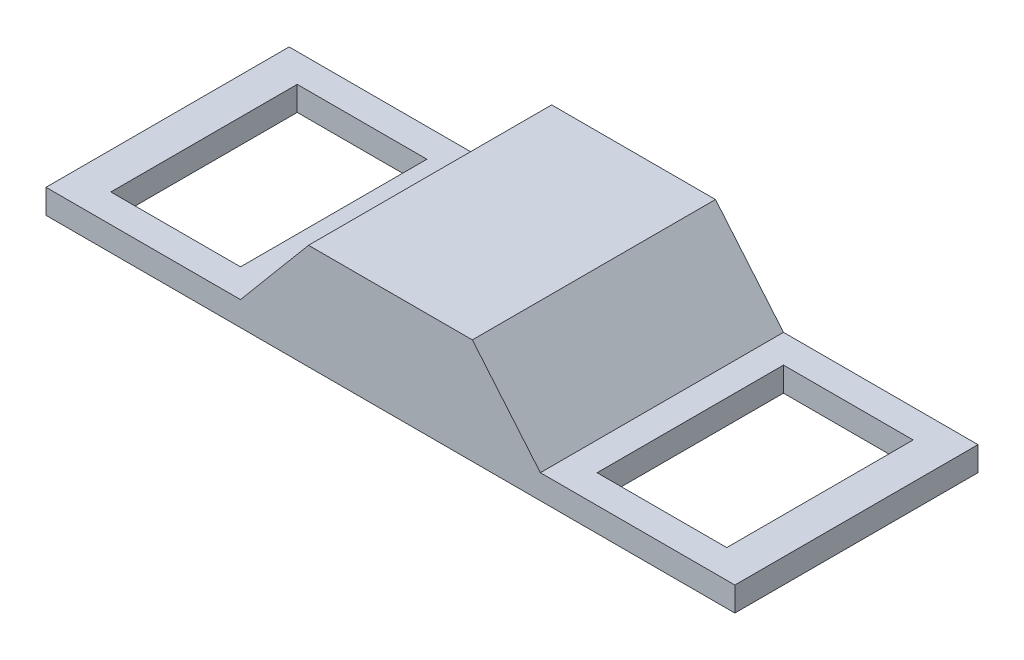
ISO-10303-21;
HEADER;
FILE_DESCRIPTION(('STEP AP214'),'2;1');
FILE_NAME('part.step','',(''),(''),'','','');
FILE_SCHEMA(('AUTOMOTIVE_DESIGN { 1 0 10303 214 1 1 1 1 }'));
ENDSEC;
DATA;
#1=APPLICATION_CONTEXT('core data for automotive mechanical design processes');
#2=APPLICATION_PROTOCOL_DEFINITION('international standard','automotive_design',2000,#1);
#3=PRODUCT_CONTEXT('',#1,'mechanical');
#4=PRODUCT('Part','Part','',(#3));
#5=PRODUCT_RELATED_PRODUCT_CATEGORY('part','',(#4));
#6=PRODUCT_DEFINITION_FORMATION('','',#4);
#7=PRODUCT_DEFINITION_CONTEXT('part definition',#1,'design');
#8=PRODUCT_DEFINITION('design','',#6,#7);
#9=PRODUCT_DEFINITION_SHAPE('','',#8);
#10=(LENGTH_UNIT() NAMED_UNIT(*) SI_UNIT(.MILLI.,.METRE.));
#11=(NAMED_UNIT(*) PLANE_ANGLE_UNIT() SI_UNIT($,.RADIAN.));
#12=(NAMED_UNIT(*) SI_UNIT($,.STERADIAN.) SOLID_ANGLE_UNIT());
#13=UNCERTAINTY_MEASURE_WITH_UNIT(LENGTH_MEASURE(1.E-05),#10,'distance_accuracy_value','');
#14=(GEOMETRIC_REPRESENTATION_CONTEXT(3) GLOBAL_UNCERTAINTY_ASSIGNED_CONTEXT((#13)) GLOBAL_UNIT_ASSIGNED_CONTEXT((#10,
#11,#12)) REPRESENTATION_CONTEXT('',''));
#15=CARTESIAN_POINT('',(0.,0.,0.));
#16=DIRECTION('',(0.,0.,1.));
#17=DIRECTION('',(1.,0.,0.));
#18=AXIS2_PLACEMENT_3D('',#15,#16,#17);
#19=CARTESIAN_POINT('',(0.,3.,0.));
#20=DIRECTION('',(0.,-1.,0.));
#21=DIRECTION('',(0.,0.,-1.));
#22=AXIS2_PLACEMENT_3D('',#19,#20,#21);
#23=PLANE('',#22);
#24=DIRECTION('',(1.,0.,0.));
#25=VECTOR('',#24,1.);
#26=CARTESIAN_POINT('',(38.,3.,11.5));
#27=LINE('',#26,#25);
#28=CARTESIAN_POINT('',(22.,3.,11.5));
#29=VERTEX_POINT('',#28);
#30=CARTESIAN_POINT('',(38.,3.,11.5));
#31=VERTEX_POINT('',#30);
#32=EDGE_CURVE('E180',#29,#31,#27,.T.);
#33=ORIENTED_EDGE('',*,*,#32,.F.);
#34=DIRECTION('',(0.,0.,1.));
#35=VECTOR('',#34,1.);
#36=CARTESIAN_POINT('',(22.,3.,11.5));
#37=LINE('',#36,#35);
#38=CARTESIAN_POINT('',(22.,3.,-11.5));
#39=VERTEX_POINT('',#38);
#40=EDGE_CURVE('E188',#39,#29,#37,.T.);
#41=ORIENTED_EDGE('',*,*,#40,.F.);
#42=DIRECTION('',(-1.,0.,0.));
#43=VECTOR('',#42,1.);
#44=CARTESIAN_POINT('',(38.,3.,-11.5));
#45=LINE('',#44,#43);
#46=CARTESIAN_POINT('',(38.,3.,-11.5));
#47=VERTEX_POINT('',#46);
#48=EDGE_CURVE('E185',#47,#39,#45,.T.);
#49=ORIENTED_EDGE('',*,*,#48,.F.);
#50=DIRECTION('',(0.,0.,-1.));
#51=VECTOR('',#50,1.);
#52=CARTESIAN_POINT('',(38.,3.,11.5));
#53=LINE('',#52,#51);
#54=EDGE_CURVE('E182',#31,#47,#53,.T.);
#55=ORIENTED_EDGE('',*,*,#54,.F.);
#56=EDGE_LOOP('',(#33,#41,#49,#55));
#57=FACE_BOUND('',#56,.T.);
#58=DIRECTION('',(0.,0.,-1.));
#59=VECTOR('',#58,1.);
#60=CARTESIAN_POINT('',(18.5,3.,15.));
#61=LINE('',#60,#59);
#62=CARTESIAN_POINT('',(18.5,3.,15.));
#63=VERTEX_POINT('',#62);
#64=CARTESIAN_POINT('',(18.5,3.,-15.));
#65=VERTEX_POINT('',#64);
#66=EDGE_CURVE('E172',#63,#65,#61,.T.);
#67=ORIENTED_EDGE('',*,*,#66,.F.);
#68=DIRECTION('',(1.,0.,0.));
#69=VECTOR('',#68,1.);
#70=CARTESIAN_POINT('',(-42.5,3.,15.));
#71=LINE('',#70,#69);
#72=CARTESIAN_POINT('',(42.5,3.,15.));
#73=VERTEX_POINT('',#72);
#74=EDGE_CURVE('E167',#63,#73,#71,.T.);
#75=ORIENTED_EDGE('',*,*,#74,.T.);
#76=DIRECTION('',(0.,0.,-1.));
#77=VECTOR('',#76,1.);
#78=CARTESIAN_POINT('',(42.5,3.,15.));
#79=LINE('',#78,#77);
#80=CARTESIAN_POINT('',(42.5,3.,-15.));
#81=VERTEX_POINT('',#80);
#82=EDGE_CURVE('E243',#73,#81,#79,.T.);
#83=ORIENTED_EDGE('',*,*,#82,.T.);
#84=DIRECTION('',(-1.,0.,0.));
#85=VECTOR('',#84,1.);
#86=CARTESIAN_POINT('',(-42.5,3.,-15.));
#87=LINE('',#86,#85);
#88=EDGE_CURVE('E248',#81,#65,#87,.T.);
#89=ORIENTED_EDGE('',*,*,#88,.T.);
#90=EDGE_LOOP('',(#67,#75,#83,#89));
#91=FACE_BOUND('',#90,.T.);
#92=ADVANCED_FACE('F41',(#57,#91),#23,.F.);
#93=DIRECTION('',(0.,0.,-1.));
#94=VECTOR('',#93,1.);
#95=CARTESIAN_POINT('',(-22.,3.,11.5));
#96=LINE('',#95,#94);
#97=CARTESIAN_POINT('',(-22.,3.,11.5));
#98=VERTEX_POINT('',#97);
#99=CARTESIAN_POINT('',(-22.,3.,-11.5));
#100=VERTEX_POINT('',#99);
#101=EDGE_CURVE('E212',#98,#100,#96,.T.);
#102=ORIENTED_EDGE('',*,*,#101,.F.);
#103=DIRECTION('',(1.,0.,0.));
#104=VECTOR('',#103,1.);
#105=CARTESIAN_POINT('',(-38.,3.,11.5));
#106=LINE('',#105,#104);
#107=CARTESIAN_POINT('',(-38.,3.,11.5));
#108=VERTEX_POINT('',#107);
#109=EDGE_CURVE('E220',#108,#98,#106,.T.);
#110=ORIENTED_EDGE('',*,*,#109,.F.);
#111=DIRECTION('',(0.,0.,1.));
#112=VECTOR('',#111,1.);
#113=CARTESIAN_POINT('',(-38.,3.,11.5));
#114=LINE('',#113,#112);
#115=CARTESIAN_POINT('',(-38.,3.,-11.5));
#116=VERTEX_POINT('',#115);
#117=EDGE_CURVE('E217',#116,#108,#114,.T.);
#118=ORIENTED_EDGE('',*,*,#117,.F.);
#119=DIRECTION('',(-1.,0.,0.));
#120=VECTOR('',#119,1.);
#121=CARTESIAN_POINT('',(-38.,3.,-11.5));
#122=LINE('',#121,#120);
#123=EDGE_CURVE('E214',#100,#116,#122,.T.);
#124=ORIENTED_EDGE('',*,*,#123,.F.);
#125=EDGE_LOOP('',(#102,#110,#118,#124));
#126=FACE_BOUND('',#125,.T.);
#127=DIRECTION('',(0.,0.,1.));
#128=VECTOR('',#127,1.);
#129=CARTESIAN_POINT('',(-18.5,3.,15.));
#130=LINE('',#129,#128);
#131=CARTESIAN_POINT('',(-18.5,3.,-15.));
#132=VERTEX_POINT('',#131);
#133=CARTESIAN_POINT('',(-18.5,3.,15.));
#134=VERTEX_POINT('',#133);
#135=EDGE_CURVE('E161',#132,#134,#130,.T.);
#136=ORIENTED_EDGE('',*,*,#135,.F.);
#137=CARTESIAN_POINT('',(-42.5,3.,-15.));
#138=VERTEX_POINT('',#137);
#139=EDGE_CURVE('E246',#132,#138,#87,.T.);
#140=ORIENTED_EDGE('',*,*,#139,.T.);
#141=DIRECTION('',(0.,0.,1.));
#142=VECTOR('',#141,1.);
#143=CARTESIAN_POINT('',(-42.5,3.,15.));
#144=LINE('',#143,#142);
#145=CARTESIAN_POINT('',(-42.5,3.,15.));
#146=VERTEX_POINT('',#145);
#147=EDGE_CURVE('E164',#138,#146,#144,.T.);
#148=ORIENTED_EDGE('',*,*,#147,.T.);
#149=EDGE_CURVE('E156',#146,#134,#71,.T.);
#150=ORIENTED_EDGE('',*,*,#149,.T.);
#151=EDGE_LOOP('',(#136,#140,#148,#150));
#152=FACE_BOUND('',#151,.T.);
#153=ADVANCED_FACE('F160',(#126,#152),#23,.F.);
#154=CARTESIAN_POINT('',(0.,0.,0.));
#155=DIRECTION('',(0.,-1.,0.));
#156=DIRECTION('',(0.,0.,-1.));
#157=AXIS2_PLACEMENT_3D('',#154,#155,#156);
#158=PLANE('',#157);
#159=DIRECTION('',(0.,0.,-1.));
#160=VECTOR('',#159,1.);
#161=CARTESIAN_POINT('',(42.5,0.,15.));
#162=LINE('',#161,#160);
#163=CARTESIAN_POINT('',(42.5,0.,15.));
#164=VERTEX_POINT('',#163);
#165=CARTESIAN_POINT('',(42.5,0.,-15.));
#166=VERTEX_POINT('',#165);
#167=EDGE_CURVE('E242',#164,#166,#162,.T.);
#168=ORIENTED_EDGE('',*,*,#167,.F.);
#169=DIRECTION('',(1.,0.,0.));
#170=VECTOR('',#169,1.);
#171=CARTESIAN_POINT('',(-42.5,0.,15.));
#172=LINE('',#171,#170);
#173=CARTESIAN_POINT('',(-42.5,0.,15.));
#174=VERTEX_POINT('',#173);
#175=EDGE_CURVE('E247',#174,#164,#172,.T.);
#176=ORIENTED_EDGE('',*,*,#175,.F.);
#177=DIRECTION('',(0.,0.,1.));
#178=VECTOR('',#177,1.);
#179=CARTESIAN_POINT('',(-42.5,0.,15.));
#180=LINE('',#179,#178);
#181=CARTESIAN_POINT('',(-42.5,0.,-15.));
#182=VERTEX_POINT('',#181);
#183=EDGE_CURVE('E256',#182,#174,#180,.T.);
#184=ORIENTED_EDGE('',*,*,#183,.F.);
#185=DIRECTION('',(-1.,0.,0.));
#186=VECTOR('',#185,1.);
#187=CARTESIAN_POINT('',(-42.5,0.,-15.));
#188=LINE('',#187,#186);
#189=EDGE_CURVE('E254',#166,#182,#188,.T.);
#190=ORIENTED_EDGE('',*,*,#189,.F.);
#191=EDGE_LOOP('',(#168,#176,#184,#190));
#192=FACE_BOUND('',#191,.T.);
#193=DIRECTION('',(1.,0.,0.));
#194=VECTOR('',#193,1.);
#195=CARTESIAN_POINT('',(-38.,0.,11.5));
#196=LINE('',#195,#194);
#197=CARTESIAN_POINT('',(-38.,0.,11.5));
#198=VERTEX_POINT('',#197);
#199=CARTESIAN_POINT('',(-22.,0.,11.5));
#200=VERTEX_POINT('',#199);
#201=EDGE_CURVE('E215',#198,#200,#196,.T.);
#202=ORIENTED_EDGE('',*,*,#201,.T.);
#203=DIRECTION('',(0.,0.,-1.));
#204=VECTOR('',#203,1.);
#205=CARTESIAN_POINT('',(-22.,0.,11.5));
#206=LINE('',#205,#204);
#207=CARTESIAN_POINT('',(-22.,0.,-11.5));
#208=VERTEX_POINT('',#207);
#209=EDGE_CURVE('E211',#200,#208,#206,.T.);
#210=ORIENTED_EDGE('',*,*,#209,.T.);
#211=DIRECTION('',(-1.,0.,0.));
#212=VECTOR('',#211,1.);
#213=CARTESIAN_POINT('',(-38.,0.,-11.5));
#214=LINE('',#213,#212);
#215=CARTESIAN_POINT('',(-38.,0.,-11.5));
#216=VERTEX_POINT('',#215);
#217=EDGE_CURVE('E225',#208,#216,#214,.T.);
#218=ORIENTED_EDGE('',*,*,#217,.T.);
#219=DIRECTION('',(0.,0.,1.));
#220=VECTOR('',#219,1.);
#221=CARTESIAN_POINT('',(-38.,0.,11.5));
#222=LINE('',#221,#220);
#223=EDGE_CURVE('E228',#216,#198,#222,.T.);
#224=ORIENTED_EDGE('',*,*,#223,.T.);
#225=EDGE_LOOP('',(#202,#210,#218,#224));
#226=FACE_BOUND('',#225,.T.);
#227=DIRECTION('',(0.,0.,1.));
#228=VECTOR('',#227,1.);
#229=CARTESIAN_POINT('',(22.,0.,11.5));
#230=LINE('',#229,#228);
#231=CARTESIAN_POINT('',(22.,0.,-11.5));
#232=VERTEX_POINT('',#231);
#233=CARTESIAN_POINT('',(22.,0.,11.5));
#234=VERTEX_POINT('',#233);
#235=EDGE_CURVE('E183',#232,#234,#230,.T.);
#236=ORIENTED_EDGE('',*,*,#235,.T.);
#237=DIRECTION('',(1.,0.,0.));
#238=VECTOR('',#237,1.);
#239=CARTESIAN_POINT('',(38.,0.,11.5));
#240=LINE('',#239,#238);
#241=CARTESIAN_POINT('',(38.,0.,11.5));
#242=VERTEX_POINT('',#241);
#243=EDGE_CURVE('E191',#234,#242,#240,.T.);
#244=ORIENTED_EDGE('',*,*,#243,.T.);
#245=DIRECTION('',(0.,0.,-1.));
#246=VECTOR('',#245,1.);
#247=CARTESIAN_POINT('',(38.,0.,11.5));
#248=LINE('',#247,#246);
#249=CARTESIAN_POINT('',(38.,0.,-11.5));
#250=VERTEX_POINT('',#249);
#251=EDGE_CURVE('E194',#242,#250,#248,.T.);
#252=ORIENTED_EDGE('',*,*,#251,.T.);
#253=DIRECTION('',(-1.,0.,0.));
#254=VECTOR('',#253,1.);
#255=CARTESIAN_POINT('',(38.,0.,-11.5));
#256=LINE('',#255,#254);
#257=EDGE_CURVE('E197',#250,#232,#256,.T.);
#258=ORIENTED_EDGE('',*,*,#257,.T.);
#259=EDGE_LOOP('',(#236,#244,#252,#258));
#260=FACE_BOUND('',#259,.T.);
#261=ADVANCED_FACE('F303',(#192,#226,#260),#158,.T.);
#262=CARTESIAN_POINT('',(42.5,3.,15.));
#263=DIRECTION('',(-1.,0.,0.));
#264=DIRECTION('',(0.,0.,1.));
#265=AXIS2_PLACEMENT_3D('',#262,#263,#264);
#266=PLANE('',#265);
#267=ORIENTED_EDGE('',*,*,#167,.T.);
#268=DIRECTION('',(0.,-1.,0.));
#269=VECTOR('',#268,1.);
#270=CARTESIAN_POINT('',(42.5,3.,-15.));
#271=LINE('',#270,#269);
#272=EDGE_CURVE('E266',#81,#166,#271,.T.);
#273=ORIENTED_EDGE('',*,*,#272,.F.);
#274=ORIENTED_EDGE('',*,*,#82,.F.);
#275=DIRECTION('',(0.,-1.,0.));
#276=VECTOR('',#275,1.);
#277=CARTESIAN_POINT('',(42.5,3.,15.));
#278=LINE('',#277,#276);
#279=EDGE_CURVE('E166',#73,#164,#278,.T.);
#280=ORIENTED_EDGE('',*,*,#279,.T.);
#281=EDGE_LOOP('',(#267,#273,#274,#280));
#282=FACE_BOUND('',#281,.T.);
#283=ADVANCED_FACE('F312',(#282),#266,.F.);
#284=CARTESIAN_POINT('',(-42.5,3.,-15.));
#285=DIRECTION('',(0.,0.,1.));
#286=DIRECTION('',(1.,0.,0.));
#287=AXIS2_PLACEMENT_3D('',#284,#285,#286);
#288=PLANE('',#287);
#289=DIRECTION('',(-1.,0.,0.));
#290=VECTOR('',#289,1.);
#291=CARTESIAN_POINT('',(-18.5,13.,-15.));
#292=LINE('',#291,#290);
#293=CARTESIAN_POINT('',(10.1090036882272,13.,-15.));
#294=VERTEX_POINT('',#293);
#295=CARTESIAN_POINT('',(-10.1090036882272,13.,-15.));
#296=VERTEX_POINT('',#295);
#297=EDGE_CURVE('E171',#294,#296,#292,.T.);
#298=ORIENTED_EDGE('',*,*,#297,.F.);
#299=DIRECTION('',(-0.642787609686538,0.766044443118979,0.));
#300=VECTOR('',#299,1.);
#301=CARTESIAN_POINT('',(10.1090036882272,13.,-15.));
#302=LINE('',#301,#300);
#303=EDGE_CURVE('E158',#294,#65,#302,.F.);
#304=ORIENTED_EDGE('',*,*,#303,.T.);
#305=ORIENTED_EDGE('',*,*,#88,.F.);
#306=ORIENTED_EDGE('',*,*,#272,.T.);
#307=ORIENTED_EDGE('',*,*,#189,.T.);
#308=DIRECTION('',(0.,-1.,0.));
#309=VECTOR('',#308,1.);
#310=CARTESIAN_POINT('',(-42.5,3.,-15.));
#311=LINE('',#310,#309);
#312=EDGE_CURVE('E263',#138,#182,#311,.T.);
#313=ORIENTED_EDGE('',*,*,#312,.F.);
#314=ORIENTED_EDGE('',*,*,#139,.F.);
#315=DIRECTION('',(-0.642787609686538,-0.766044443118979,0.));
#316=VECTOR('',#315,1.);
#317=CARTESIAN_POINT('',(-10.1090036882272,13.,-15.));
#318=LINE('',#317,#316);
#319=EDGE_CURVE('E170',#132,#296,#318,.F.);
#320=ORIENTED_EDGE('',*,*,#319,.T.);
#321=EDGE_LOOP('',(#298,#304,#305,#306,#307,#313,#314,#320));
#322=FACE_BOUND('',#321,.T.);
#323=ADVANCED_FACE('F277',(#322),#288,.F.);
#324=CARTESIAN_POINT('',(-42.5,3.,15.));
#325=DIRECTION('',(1.,0.,0.));
#326=DIRECTION('',(0.,0.,-1.));
#327=AXIS2_PLACEMENT_3D('',#324,#325,#326);
#328=PLANE('',#327);
#329=ORIENTED_EDGE('',*,*,#183,.T.);
#330=DIRECTION('',(0.,-1.,0.));
#331=VECTOR('',#330,1.);
#332=CARTESIAN_POINT('',(-42.5,3.,15.));
#333=LINE('',#332,#331);
#334=EDGE_CURVE('E261',#146,#174,#333,.T.);
#335=ORIENTED_EDGE('',*,*,#334,.F.);
#336=ORIENTED_EDGE('',*,*,#147,.F.);
#337=ORIENTED_EDGE('',*,*,#312,.T.);
#338=EDGE_LOOP('',(#329,#335,#336,#337));
#339=FACE_BOUND('',#338,.T.);
#340=ADVANCED_FACE('F315',(#339),#328,.F.);
#341=CARTESIAN_POINT('',(-42.5,3.,15.));
#342=DIRECTION('',(0.,0.,-1.));
#343=DIRECTION('',(-1.,0.,0.));
#344=AXIS2_PLACEMENT_3D('',#341,#342,#343);
#345=PLANE('',#344);
#346=ORIENTED_EDGE('',*,*,#74,.F.);
#347=DIRECTION('',(0.642787609686538,-0.766044443118979,0.));
#348=VECTOR('',#347,1.);
#349=CARTESIAN_POINT('',(10.1090036882272,13.,15.));
#350=LINE('',#349,#348);
#351=CARTESIAN_POINT('',(10.1090036882272,13.,15.));
#352=VERTEX_POINT('',#351);
#353=EDGE_CURVE('E11',#63,#352,#350,.F.);
#354=ORIENTED_EDGE('',*,*,#353,.T.);
#355=DIRECTION('',(1.,0.,0.));
#356=VECTOR('',#355,1.);
#357=CARTESIAN_POINT('',(-18.5,13.,15.));
#358=LINE('',#357,#356);
#359=CARTESIAN_POINT('',(-10.1090036882272,13.,15.));
#360=VERTEX_POINT('',#359);
#361=EDGE_CURVE('E157',#360,#352,#358,.T.);
#362=ORIENTED_EDGE('',*,*,#361,.F.);
#363=DIRECTION('',(0.642787609686538,0.766044443118979,0.));
#364=VECTOR('',#363,1.);
#365=CARTESIAN_POINT('',(-10.1090036882272,13.,15.));
#366=LINE('',#365,#364);
#367=EDGE_CURVE('E50',#360,#134,#366,.F.);
#368=ORIENTED_EDGE('',*,*,#367,.T.);
#369=ORIENTED_EDGE('',*,*,#149,.F.);
#370=ORIENTED_EDGE('',*,*,#334,.T.);
#371=ORIENTED_EDGE('',*,*,#175,.T.);
#372=ORIENTED_EDGE('',*,*,#279,.F.);
#373=EDGE_LOOP('',(#346,#354,#362,#368,#369,#370,#371,#372));
#374=FACE_BOUND('',#373,.T.);
#375=ADVANCED_FACE('F154',(#374),#345,.F.);
#376=CARTESIAN_POINT('',(-22.,3.,11.5));
#377=DIRECTION('',(-1.,0.,0.));
#378=DIRECTION('',(0.,0.,1.));
#379=AXIS2_PLACEMENT_3D('',#376,#377,#378);
#380=PLANE('',#379);
#381=ORIENTED_EDGE('',*,*,#209,.F.);
#382=DIRECTION('',(0.,-1.,0.));
#383=VECTOR('',#382,1.);
#384=CARTESIAN_POINT('',(-22.,3.,11.5));
#385=LINE('',#384,#383);
#386=EDGE_CURVE('E222',#98,#200,#385,.T.);
#387=ORIENTED_EDGE('',*,*,#386,.F.);
#388=ORIENTED_EDGE('',*,*,#101,.T.);
#389=DIRECTION('',(0.,-1.,0.));
#390=VECTOR('',#389,1.);
#391=CARTESIAN_POINT('',(-22.,3.,-11.5));
#392=LINE('',#391,#390);
#393=EDGE_CURVE('E239',#100,#208,#392,.T.);
#394=ORIENTED_EDGE('',*,*,#393,.T.);
#395=EDGE_LOOP('',(#381,#387,#388,#394));
#396=FACE_BOUND('',#395,.T.);
#397=ADVANCED_FACE('F308',(#396),#380,.T.);
#398=CARTESIAN_POINT('',(-38.,3.,-11.5));
#399=DIRECTION('',(0.,0.,1.));
#400=DIRECTION('',(1.,0.,0.));
#401=AXIS2_PLACEMENT_3D('',#398,#399,#400);
#402=PLANE('',#401);
#403=ORIENTED_EDGE('',*,*,#217,.F.);
#404=ORIENTED_EDGE('',*,*,#393,.F.);
#405=ORIENTED_EDGE('',*,*,#123,.T.);
#406=DIRECTION('',(0.,-1.,0.));
#407=VECTOR('',#406,1.);
#408=CARTESIAN_POINT('',(-38.,3.,-11.5));
#409=LINE('',#408,#407);
#410=EDGE_CURVE('E237',#116,#216,#409,.T.);
#411=ORIENTED_EDGE('',*,*,#410,.T.);
#412=EDGE_LOOP('',(#403,#404,#405,#411));
#413=FACE_BOUND('',#412,.T.);
#414=ADVANCED_FACE('F366',(#413),#402,.T.);
#415=CARTESIAN_POINT('',(-38.,3.,11.5));
#416=DIRECTION('',(1.,0.,0.));
#417=DIRECTION('',(0.,0.,-1.));
#418=AXIS2_PLACEMENT_3D('',#415,#416,#417);
#419=PLANE('',#418);
#420=ORIENTED_EDGE('',*,*,#223,.F.);
#421=ORIENTED_EDGE('',*,*,#410,.F.);
#422=ORIENTED_EDGE('',*,*,#117,.T.);
#423=DIRECTION('',(0.,-1.,0.));
#424=VECTOR('',#423,1.);
#425=CARTESIAN_POINT('',(-38.,3.,11.5));
#426=LINE('',#425,#424);
#427=EDGE_CURVE('E235',#108,#198,#426,.T.);
#428=ORIENTED_EDGE('',*,*,#427,.T.);
#429=EDGE_LOOP('',(#420,#421,#422,#428));
#430=FACE_BOUND('',#429,.T.);
#431=ADVANCED_FACE('F363',(#430),#419,.T.);
#432=CARTESIAN_POINT('',(-38.,3.,11.5));
#433=DIRECTION('',(0.,0.,-1.));
#434=DIRECTION('',(-1.,0.,0.));
#435=AXIS2_PLACEMENT_3D('',#432,#433,#434);
#436=PLANE('',#435);
#437=ORIENTED_EDGE('',*,*,#201,.F.);
#438=ORIENTED_EDGE('',*,*,#427,.F.);
#439=ORIENTED_EDGE('',*,*,#109,.T.);
#440=ORIENTED_EDGE('',*,*,#386,.T.);
#441=EDGE_LOOP('',(#437,#438,#439,#440));
#442=FACE_BOUND('',#441,.T.);
#443=ADVANCED_FACE('F360',(#442),#436,.T.);
#444=CARTESIAN_POINT('',(38.,3.,11.5));
#445=DIRECTION('',(0.,0.,-1.));
#446=DIRECTION('',(-1.,0.,0.));
#447=AXIS2_PLACEMENT_3D('',#444,#445,#446);
#448=PLANE('',#447);
#449=ORIENTED_EDGE('',*,*,#243,.F.);
#450=DIRECTION('',(0.,-1.,0.));
#451=VECTOR('',#450,1.);
#452=CARTESIAN_POINT('',(22.,3.,11.5));
#453=LINE('',#452,#451);
#454=EDGE_CURVE('E190',#29,#234,#453,.T.);
#455=ORIENTED_EDGE('',*,*,#454,.F.);
#456=ORIENTED_EDGE('',*,*,#32,.T.);
#457=DIRECTION('',(0.,-1.,0.));
#458=VECTOR('',#457,1.);
#459=CARTESIAN_POINT('',(38.,3.,11.5));
#460=LINE('',#459,#458);
#461=EDGE_CURVE('E208',#31,#242,#460,.T.);
#462=ORIENTED_EDGE('',*,*,#461,.T.);
#463=EDGE_LOOP('',(#449,#455,#456,#462));
#464=FACE_BOUND('',#463,.T.);
#465=ADVANCED_FACE('F343',(#464),#448,.T.);
#466=CARTESIAN_POINT('',(38.,3.,11.5));
#467=DIRECTION('',(-1.,0.,0.));
#468=DIRECTION('',(0.,0.,1.));
#469=AXIS2_PLACEMENT_3D('',#466,#467,#468);
#470=PLANE('',#469);
#471=ORIENTED_EDGE('',*,*,#251,.F.);
#472=ORIENTED_EDGE('',*,*,#461,.F.);
#473=ORIENTED_EDGE('',*,*,#54,.T.);
#474=DIRECTION('',(0.,-1.,0.));
#475=VECTOR('',#474,1.);
#476=CARTESIAN_POINT('',(38.,3.,-11.5));
#477=LINE('',#476,#475);
#478=EDGE_CURVE('E206',#47,#250,#477,.T.);
#479=ORIENTED_EDGE('',*,*,#478,.T.);
#480=EDGE_LOOP('',(#471,#472,#473,#479));
#481=FACE_BOUND('',#480,.T.);
#482=ADVANCED_FACE('F349',(#481),#470,.T.);
#483=CARTESIAN_POINT('',(38.,3.,-11.5));
#484=DIRECTION('',(0.,0.,1.));
#485=DIRECTION('',(1.,0.,0.));
#486=AXIS2_PLACEMENT_3D('',#483,#484,#485);
#487=PLANE('',#486);
#488=ORIENTED_EDGE('',*,*,#257,.F.);
#489=ORIENTED_EDGE('',*,*,#478,.F.);
#490=ORIENTED_EDGE('',*,*,#48,.T.);
#491=DIRECTION('',(0.,-1.,0.));
#492=VECTOR('',#491,1.);
#493=CARTESIAN_POINT('',(22.,3.,-11.5));
#494=LINE('',#493,#492);
#495=EDGE_CURVE('E204',#39,#232,#494,.T.);
#496=ORIENTED_EDGE('',*,*,#495,.T.);
#497=EDGE_LOOP('',(#488,#489,#490,#496));
#498=FACE_BOUND('',#497,.T.);
#499=ADVANCED_FACE('F294',(#498),#487,.T.);
#500=CARTESIAN_POINT('',(22.,3.,11.5));
#501=DIRECTION('',(1.,0.,0.));
#502=DIRECTION('',(0.,0.,-1.));
#503=AXIS2_PLACEMENT_3D('',#500,#501,#502);
#504=PLANE('',#503);
#505=ORIENTED_EDGE('',*,*,#235,.F.);
#506=ORIENTED_EDGE('',*,*,#495,.F.);
#507=ORIENTED_EDGE('',*,*,#40,.T.);
#508=ORIENTED_EDGE('',*,*,#454,.T.);
#509=EDGE_LOOP('',(#505,#506,#507,#508));
#510=FACE_BOUND('',#509,.T.);
#511=ADVANCED_FACE('F287',(#510),#504,.T.);
#512=CARTESIAN_POINT('',(0.,13.,0.));
#513=DIRECTION('',(0.,-1.,0.));
#514=DIRECTION('',(0.,0.,-1.));
#515=AXIS2_PLACEMENT_3D('',#512,#513,#514);
#516=PLANE('',#515);
#517=ORIENTED_EDGE('',*,*,#361,.T.);
#518=DIRECTION('',(0.,0.,-1.));
#519=VECTOR('',#518,1.);
#520=CARTESIAN_POINT('',(10.1090036882272,13.,0.));
#521=LINE('',#520,#519);
#522=EDGE_CURVE('E271',#352,#294,#521,.T.);
#523=ORIENTED_EDGE('',*,*,#522,.T.);
#524=ORIENTED_EDGE('',*,*,#297,.T.);
#525=DIRECTION('',(0.,0.,1.));
#526=VECTOR('',#525,1.);
#527=CARTESIAN_POINT('',(-10.1090036882272,13.,0.));
#528=LINE('',#527,#526);
#529=EDGE_CURVE('E269',#296,#360,#528,.T.);
#530=ORIENTED_EDGE('',*,*,#529,.T.);
#531=EDGE_LOOP('',(#517,#523,#524,#530));
#532=FACE_BOUND('',#531,.T.);
#533=ADVANCED_FACE('F285',(#532),#516,.F.);
#534=CARTESIAN_POINT('',(10.1090036882272,13.,0.));
#535=DIRECTION('',(-0.766044443118979,-0.642787609686538,0.));
#536=DIRECTION('',(0.,0.,-1.));
#537=AXIS2_PLACEMENT_3D('',#534,#535,#536);
#538=PLANE('',#537);
#539=ORIENTED_EDGE('',*,*,#353,.F.);
#540=ORIENTED_EDGE('',*,*,#66,.T.);
#541=ORIENTED_EDGE('',*,*,#303,.F.);
#542=ORIENTED_EDGE('',*,*,#522,.F.);
#543=EDGE_LOOP('',(#539,#540,#541,#542));
#544=FACE_BOUND('',#543,.T.);
#545=ADVANCED_FACE('F283',(#544),#538,.F.);
#546=CARTESIAN_POINT('',(-10.1090036882272,13.,0.));
#547=DIRECTION('',(0.766044443118979,-0.642787609686538,0.));
#548=DIRECTION('',(0.,0.,1.));
#549=AXIS2_PLACEMENT_3D('',#546,#547,#548);
#550=PLANE('',#549);
#551=ORIENTED_EDGE('',*,*,#319,.F.);
#552=ORIENTED_EDGE('',*,*,#135,.T.);
#553=ORIENTED_EDGE('',*,*,#367,.F.);
#554=ORIENTED_EDGE('',*,*,#529,.F.);
#555=EDGE_LOOP('',(#551,#552,#553,#554));
#556=FACE_BOUND('',#555,.T.);
#557=ADVANCED_FACE('F44',(#556),#550,.F.);
#558=CLOSED_SHELL('',(#92,#153,#261,#283,#323,#340,#375,#397,#414,#431,#443,#465,#482,#499,#511,
#533,#545,#557));
#559=MANIFOLD_SOLID_BREP('B2',#558);
#560=ADVANCED_BREP_SHAPE_REPRESENTATION('',(#18,#559),#14);
#561=SHAPE_DEFINITION_REPRESENTATION(#9,#560);
ENDSEC;
END-ISO-10303-21;
